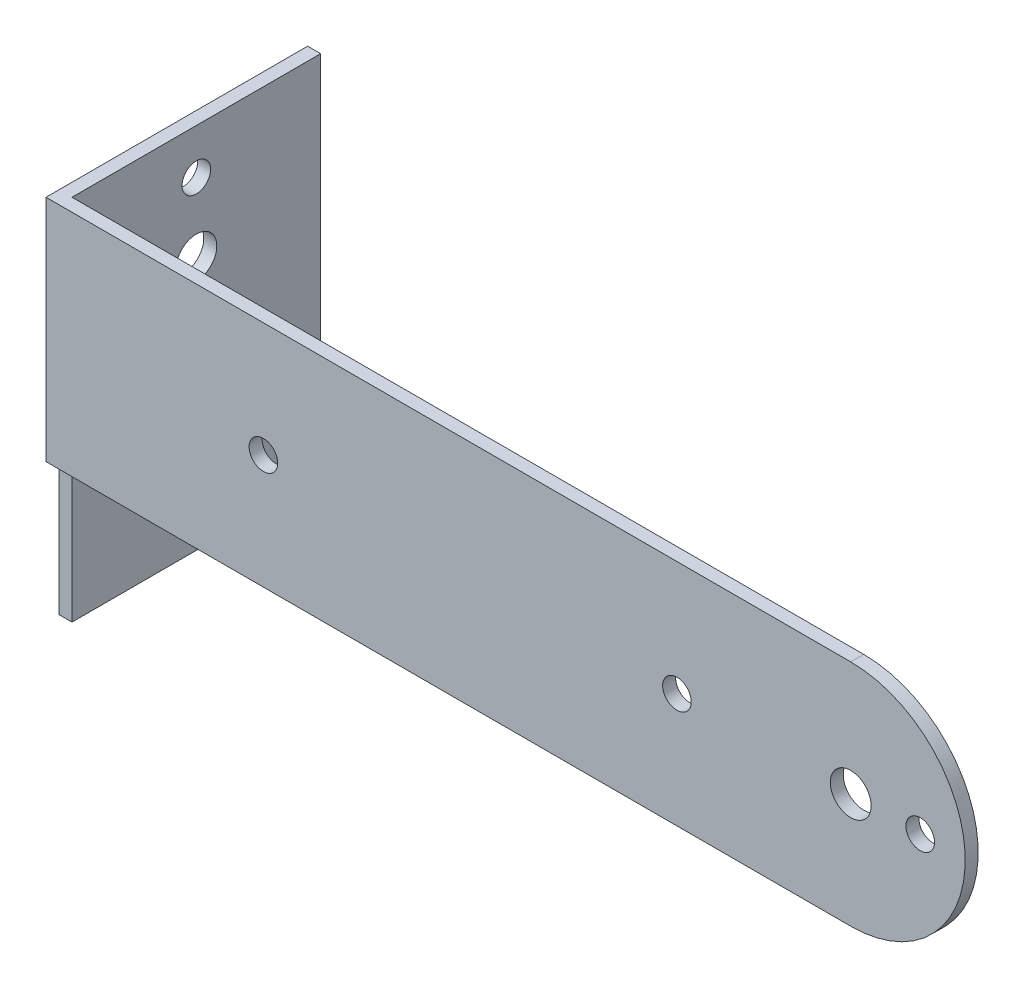
ISO-10303-21;
HEADER;
FILE_DESCRIPTION(('STEP AP214'),'2;1');
FILE_NAME('part.step','',(''),(''),'','','');
FILE_SCHEMA(('AUTOMOTIVE_DESIGN { 1 0 10303 214 1 1 1 1 }'));
ENDSEC;
DATA;
#1=APPLICATION_CONTEXT('core data for automotive mechanical design processes');
#2=APPLICATION_PROTOCOL_DEFINITION('international standard','automotive_design',2000,#1);
#3=PRODUCT_CONTEXT('',#1,'mechanical');
#4=PRODUCT('Part','Part','',(#3));
#5=PRODUCT_RELATED_PRODUCT_CATEGORY('part','',(#4));
#6=PRODUCT_DEFINITION_FORMATION('','',#4);
#7=PRODUCT_DEFINITION_CONTEXT('part definition',#1,'design');
#8=PRODUCT_DEFINITION('design','',#6,#7);
#9=PRODUCT_DEFINITION_SHAPE('','',#8);
#10=(LENGTH_UNIT() NAMED_UNIT(*) SI_UNIT(.MILLI.,.METRE.));
#11=(NAMED_UNIT(*) PLANE_ANGLE_UNIT() SI_UNIT($,.RADIAN.));
#12=(NAMED_UNIT(*) SI_UNIT($,.STERADIAN.) SOLID_ANGLE_UNIT());
#13=UNCERTAINTY_MEASURE_WITH_UNIT(LENGTH_MEASURE(1.E-05),#10,'distance_accuracy_value','');
#14=(GEOMETRIC_REPRESENTATION_CONTEXT(3) GLOBAL_UNCERTAINTY_ASSIGNED_CONTEXT((#13)) GLOBAL_UNIT_ASSIGNED_CONTEXT((#10,
#11,#12)) REPRESENTATION_CONTEXT('',''));
#15=CARTESIAN_POINT('',(0.,0.,0.));
#16=DIRECTION('',(0.,0.,1.));
#17=DIRECTION('',(1.,0.,0.));
#18=AXIS2_PLACEMENT_3D('',#15,#16,#17);
#19=CARTESIAN_POINT('',(0.,0.,0.));
#20=DIRECTION('',(0.,0.,1.));
#21=DIRECTION('',(1.,0.,0.));
#22=AXIS2_PLACEMENT_3D('',#19,#20,#21);
#23=PLANE('',#22);
#24=CARTESIAN_POINT('',(8.5,0.,0.));
#25=DIRECTION('',(0.,0.,-1.));
#26=DIRECTION('',(-1.,0.,0.));
#27=AXIS2_PLACEMENT_3D('',#24,#25,#26);
#28=CIRCLE('',#27,1.75);
#29=CARTESIAN_POINT('',(6.75,0.,0.));
#30=VERTEX_POINT('',#29);
#31=EDGE_CURVE('E187',#30,#30,#28,.T.);
#32=ORIENTED_EDGE('',*,*,#31,.F.);
#33=EDGE_LOOP('',(#32));
#34=FACE_BOUND('',#33,.T.);
#35=CARTESIAN_POINT('',(0.,0.,0.));
#36=DIRECTION('',(0.,0.,-1.));
#37=DIRECTION('',(-1.,0.,0.));
#38=AXIS2_PLACEMENT_3D('',#35,#36,#37);
#39=CIRCLE('',#38,2.5);
#40=CARTESIAN_POINT('',(-2.5,0.,0.));
#41=VERTEX_POINT('',#40);
#42=EDGE_CURVE('E193',#41,#41,#39,.T.);
#43=ORIENTED_EDGE('',*,*,#42,.F.);
#44=EDGE_LOOP('',(#43));
#45=FACE_BOUND('',#44,.T.);
#46=CARTESIAN_POINT('',(-21.25,0.,0.));
#47=DIRECTION('',(0.,0.,-1.));
#48=DIRECTION('',(-1.,0.,0.));
#49=AXIS2_PLACEMENT_3D('',#46,#47,#48);
#50=CIRCLE('',#49,1.75);
#51=CARTESIAN_POINT('',(-23.,0.,0.));
#52=VERTEX_POINT('',#51);
#53=EDGE_CURVE('E166',#52,#52,#50,.T.);
#54=ORIENTED_EDGE('',*,*,#53,.F.);
#55=EDGE_LOOP('',(#54));
#56=FACE_BOUND('',#55,.T.);
#57=CARTESIAN_POINT('',(-71.82,0.,0.));
#58=DIRECTION('',(0.,0.,-1.));
#59=DIRECTION('',(-1.,0.,0.));
#60=AXIS2_PLACEMENT_3D('',#57,#58,#59);
#61=CIRCLE('',#60,1.75);
#62=CARTESIAN_POINT('',(-73.57,0.,0.));
#63=VERTEX_POINT('',#62);
#64=EDGE_CURVE('E132',#63,#63,#61,.T.);
#65=ORIENTED_EDGE('',*,*,#64,.F.);
#66=EDGE_LOOP('',(#65));
#67=FACE_BOUND('',#66,.T.);
#68=DIRECTION('',(0.,-1.,0.));
#69=VECTOR('',#68,1.);
#70=CARTESIAN_POINT('',(-96.8200000000001,14.,0.));
#71=LINE('',#70,#69);
#72=CARTESIAN_POINT('',(-96.82,14.,0.));
#73=VERTEX_POINT('',#72);
#74=CARTESIAN_POINT('',(-96.8200000000001,-14.,0.));
#75=VERTEX_POINT('',#74);
#76=EDGE_CURVE('E51',#73,#75,#71,.T.);
#77=ORIENTED_EDGE('',*,*,#76,.F.);
#78=DIRECTION('',(-1.,0.,0.));
#79=VECTOR('',#78,1.);
#80=CARTESIAN_POINT('',(0.,14.,0.));
#81=LINE('',#80,#79);
#82=CARTESIAN_POINT('',(0.,14.,0.));
#83=VERTEX_POINT('',#82);
#84=EDGE_CURVE('E159',#83,#73,#81,.T.);
#85=ORIENTED_EDGE('',*,*,#84,.F.);
#86=CARTESIAN_POINT('',(0.,0.,0.));
#87=DIRECTION('',(0.,0.,1.));
#88=DIRECTION('',(1.,0.,0.));
#89=AXIS2_PLACEMENT_3D('',#86,#87,#88);
#90=CIRCLE('',#89,14.);
#91=CARTESIAN_POINT('',(0.,-14.,0.));
#92=VERTEX_POINT('',#91);
#93=EDGE_CURVE('E149',#92,#83,#90,.T.);
#94=ORIENTED_EDGE('',*,*,#93,.F.);
#95=DIRECTION('',(1.,0.,0.));
#96=VECTOR('',#95,1.);
#97=CARTESIAN_POINT('',(-98.41,-14.,0.));
#98=LINE('',#97,#96);
#99=EDGE_CURVE('E76',#75,#92,#98,.T.);
#100=ORIENTED_EDGE('',*,*,#99,.F.);
#101=EDGE_LOOP('',(#77,#85,#94,#100));
#102=FACE_BOUND('',#101,.T.);
#103=ADVANCED_FACE('F34',(#34,#45,#56,#67,#102),#23,.F.);
#104=CARTESIAN_POINT('',(0.,0.,1.59));
#105=DIRECTION('',(0.,0.,-1.));
#106=DIRECTION('',(-1.,0.,0.));
#107=AXIS2_PLACEMENT_3D('',#104,#105,#106);
#108=CYLINDRICAL_SURFACE('',#107,14.);
#109=ORIENTED_EDGE('',*,*,#93,.T.);
#110=DIRECTION('',(0.,0.,-1.));
#111=VECTOR('',#110,1.);
#112=CARTESIAN_POINT('',(0.,14.,1.59));
#113=LINE('',#112,#111);
#114=CARTESIAN_POINT('',(0.,14.,1.59));
#115=VERTEX_POINT('',#114);
#116=EDGE_CURVE('E11',#115,#83,#113,.T.);
#117=ORIENTED_EDGE('',*,*,#116,.F.);
#118=CARTESIAN_POINT('',(0.,0.,1.59));
#119=DIRECTION('',(0.,0.,1.));
#120=DIRECTION('',(1.,0.,0.));
#121=AXIS2_PLACEMENT_3D('',#118,#119,#120);
#122=CIRCLE('',#121,14.);
#123=CARTESIAN_POINT('',(0.,-14.,1.59));
#124=VERTEX_POINT('',#123);
#125=EDGE_CURVE('E150',#124,#115,#122,.T.);
#126=ORIENTED_EDGE('',*,*,#125,.F.);
#127=DIRECTION('',(0.,0.,-1.));
#128=VECTOR('',#127,1.);
#129=CARTESIAN_POINT('',(0.,-14.,1.59));
#130=LINE('',#129,#128);
#131=EDGE_CURVE('E156',#124,#92,#130,.T.);
#132=ORIENTED_EDGE('',*,*,#131,.T.);
#133=EDGE_LOOP('',(#109,#117,#126,#132));
#134=FACE_BOUND('',#133,.T.);
#135=ADVANCED_FACE('F36',(#134),#108,.T.);
#136=CARTESIAN_POINT('',(0.,14.,1.59));
#137=DIRECTION('',(0.,-1.,0.));
#138=DIRECTION('',(0.,0.,-1.));
#139=AXIS2_PLACEMENT_3D('',#136,#137,#138);
#140=PLANE('',#139);
#141=ORIENTED_EDGE('',*,*,#84,.T.);
#142=DIRECTION('',(0.,0.,1.));
#143=VECTOR('',#142,1.);
#144=CARTESIAN_POINT('',(-96.8200000000001,14.,-30.41));
#145=LINE('',#144,#143);
#146=CARTESIAN_POINT('',(-96.8200000000001,14.,-30.41));
#147=VERTEX_POINT('',#146);
#148=EDGE_CURVE('E119',#147,#73,#145,.T.);
#149=ORIENTED_EDGE('',*,*,#148,.F.);
#150=DIRECTION('',(1.,0.,0.));
#151=VECTOR('',#150,1.);
#152=CARTESIAN_POINT('',(-98.41,14.,-30.41));
#153=LINE('',#152,#151);
#154=CARTESIAN_POINT('',(-98.41,14.,-30.41));
#155=VERTEX_POINT('',#154);
#156=EDGE_CURVE('E116',#155,#147,#153,.T.);
#157=ORIENTED_EDGE('',*,*,#156,.F.);
#158=DIRECTION('',(0.,0.,-1.));
#159=VECTOR('',#158,1.);
#160=CARTESIAN_POINT('',(-98.41,14.,1.59));
#161=LINE('',#160,#159);
#162=CARTESIAN_POINT('',(-98.41,14.,1.59));
#163=VERTEX_POINT('',#162);
#164=EDGE_CURVE('E43',#163,#155,#161,.T.);
#165=ORIENTED_EDGE('',*,*,#164,.F.);
#166=DIRECTION('',(-1.,0.,0.));
#167=VECTOR('',#166,1.);
#168=CARTESIAN_POINT('',(0.,14.,1.59));
#169=LINE('',#168,#167);
#170=EDGE_CURVE('E83',#115,#163,#169,.T.);
#171=ORIENTED_EDGE('',*,*,#170,.F.);
#172=ORIENTED_EDGE('',*,*,#116,.T.);
#173=EDGE_LOOP('',(#141,#149,#157,#165,#171,#172));
#174=FACE_BOUND('',#173,.T.);
#175=ADVANCED_FACE('F117',(#174),#140,.F.);
#176=CARTESIAN_POINT('',(-98.41,14.,1.59));
#177=DIRECTION('',(1.,0.,0.));
#178=DIRECTION('',(0.,0.,-1.));
#179=AXIS2_PLACEMENT_3D('',#176,#177,#178);
#180=PLANE('',#179);
#181=CARTESIAN_POINT('',(-98.41,8.5,-15.205));
#182=DIRECTION('',(-1.,0.,0.));
#183=DIRECTION('',(0.,0.,1.));
#184=AXIS2_PLACEMENT_3D('',#181,#182,#183);
#185=CIRCLE('',#184,1.75);
#186=CARTESIAN_POINT('',(-98.41,8.5,-13.455));
#187=VERTEX_POINT('',#186);
#188=EDGE_CURVE('E170',#187,#187,#185,.T.);
#189=ORIENTED_EDGE('',*,*,#188,.F.);
#190=EDGE_LOOP('',(#189));
#191=FACE_BOUND('',#190,.T.);
#192=CARTESIAN_POINT('',(-98.41,-21.25,-15.205));
#193=DIRECTION('',(-1.,0.,0.));
#194=DIRECTION('',(0.,0.,1.));
#195=AXIS2_PLACEMENT_3D('',#192,#193,#194);
#196=CIRCLE('',#195,1.75);
#197=CARTESIAN_POINT('',(-98.41,-21.25,-13.455));
#198=VERTEX_POINT('',#197);
#199=EDGE_CURVE('E175',#198,#198,#196,.T.);
#200=ORIENTED_EDGE('',*,*,#199,.F.);
#201=EDGE_LOOP('',(#200));
#202=FACE_BOUND('',#201,.T.);
#203=CARTESIAN_POINT('',(-98.41,0.,-15.205));
#204=DIRECTION('',(-1.,0.,0.));
#205=DIRECTION('',(0.,0.,1.));
#206=AXIS2_PLACEMENT_3D('',#203,#204,#205);
#207=CIRCLE('',#206,2.5);
#208=CARTESIAN_POINT('',(-98.41,0.,-12.705));
#209=VERTEX_POINT('',#208);
#210=EDGE_CURVE('E167',#209,#209,#207,.T.);
#211=ORIENTED_EDGE('',*,*,#210,.F.);
#212=EDGE_LOOP('',(#211));
#213=FACE_BOUND('',#212,.T.);
#214=ORIENTED_EDGE('',*,*,#164,.T.);
#215=DIRECTION('',(0.,1.,0.));
#216=VECTOR('',#215,1.);
#217=CARTESIAN_POINT('',(-98.41,14.,-30.41));
#218=LINE('',#217,#216);
#219=CARTESIAN_POINT('',(-98.41,-31.,-30.41));
#220=VERTEX_POINT('',#219);
#221=EDGE_CURVE('E110',#220,#155,#218,.T.);
#222=ORIENTED_EDGE('',*,*,#221,.F.);
#223=DIRECTION('',(0.,0.,1.));
#224=VECTOR('',#223,1.);
#225=CARTESIAN_POINT('',(-98.41,-31.,-30.41));
#226=LINE('',#225,#224);
#227=CARTESIAN_POINT('',(-98.41,-31.,0.));
#228=VERTEX_POINT('',#227);
#229=EDGE_CURVE('E137',#220,#228,#226,.T.);
#230=ORIENTED_EDGE('',*,*,#229,.T.);
#231=DIRECTION('',(0.,1.,0.));
#232=VECTOR('',#231,1.);
#233=CARTESIAN_POINT('',(-98.41,14.,0.));
#234=LINE('',#233,#232);
#235=CARTESIAN_POINT('',(-98.41,-14.,0.));
#236=VERTEX_POINT('',#235);
#237=EDGE_CURVE('E138',#228,#236,#234,.T.);
#238=ORIENTED_EDGE('',*,*,#237,.T.);
#239=DIRECTION('',(0.,0.,-1.));
#240=VECTOR('',#239,1.);
#241=CARTESIAN_POINT('',(-98.41,-14.,1.59));
#242=LINE('',#241,#240);
#243=CARTESIAN_POINT('',(-98.41,-14.,1.59));
#244=VERTEX_POINT('',#243);
#245=EDGE_CURVE('E113',#244,#236,#242,.T.);
#246=ORIENTED_EDGE('',*,*,#245,.F.);
#247=DIRECTION('',(0.,-1.,0.));
#248=VECTOR('',#247,1.);
#249=CARTESIAN_POINT('',(-98.41,14.,1.59));
#250=LINE('',#249,#248);
#251=EDGE_CURVE('E112',#163,#244,#250,.T.);
#252=ORIENTED_EDGE('',*,*,#251,.F.);
#253=EDGE_LOOP('',(#214,#222,#230,#238,#246,#252));
#254=FACE_BOUND('',#253,.T.);
#255=ADVANCED_FACE('F107',(#191,#202,#213,#254),#180,.F.);
#256=CARTESIAN_POINT('',(-98.41,-14.,1.59));
#257=DIRECTION('',(0.,1.,0.));
#258=DIRECTION('',(0.,0.,1.));
#259=AXIS2_PLACEMENT_3D('',#256,#257,#258);
#260=PLANE('',#259);
#261=EDGE_CURVE('E152',#236,#75,#98,.T.);
#262=ORIENTED_EDGE('',*,*,#261,.T.);
#263=ORIENTED_EDGE('',*,*,#99,.T.);
#264=ORIENTED_EDGE('',*,*,#131,.F.);
#265=DIRECTION('',(1.,0.,0.));
#266=VECTOR('',#265,1.);
#267=CARTESIAN_POINT('',(-98.41,-14.,1.59));
#268=LINE('',#267,#266);
#269=EDGE_CURVE('E60',#244,#124,#268,.T.);
#270=ORIENTED_EDGE('',*,*,#269,.F.);
#271=ORIENTED_EDGE('',*,*,#245,.T.);
#272=EDGE_LOOP('',(#262,#263,#264,#270,#271));
#273=FACE_BOUND('',#272,.T.);
#274=ADVANCED_FACE('F221',(#273),#260,.F.);
#275=CARTESIAN_POINT('',(0.,0.,1.59));
#276=DIRECTION('',(0.,0.,1.));
#277=DIRECTION('',(1.,0.,0.));
#278=AXIS2_PLACEMENT_3D('',#275,#276,#277);
#279=PLANE('',#278);
#280=CARTESIAN_POINT('',(8.5,0.,1.59));
#281=DIRECTION('',(0.,0.,-1.));
#282=DIRECTION('',(-1.,0.,0.));
#283=AXIS2_PLACEMENT_3D('',#280,#281,#282);
#284=CIRCLE('',#283,1.75);
#285=CARTESIAN_POINT('',(6.75,0.,1.59));
#286=VERTEX_POINT('',#285);
#287=EDGE_CURVE('E184',#286,#286,#284,.T.);
#288=ORIENTED_EDGE('',*,*,#287,.T.);
#289=EDGE_LOOP('',(#288));
#290=FACE_BOUND('',#289,.T.);
#291=CARTESIAN_POINT('',(0.,0.,1.59));
#292=DIRECTION('',(0.,0.,-1.));
#293=DIRECTION('',(-1.,0.,0.));
#294=AXIS2_PLACEMENT_3D('',#291,#292,#293);
#295=CIRCLE('',#294,2.5);
#296=CARTESIAN_POINT('',(-2.5,0.,1.59));
#297=VERTEX_POINT('',#296);
#298=EDGE_CURVE('E190',#297,#297,#295,.T.);
#299=ORIENTED_EDGE('',*,*,#298,.T.);
#300=EDGE_LOOP('',(#299));
#301=FACE_BOUND('',#300,.T.);
#302=CARTESIAN_POINT('',(-21.25,0.,1.59));
#303=DIRECTION('',(0.,0.,-1.));
#304=DIRECTION('',(-1.,0.,0.));
#305=AXIS2_PLACEMENT_3D('',#302,#303,#304);
#306=CIRCLE('',#305,1.75);
#307=CARTESIAN_POINT('',(-23.,0.,1.59));
#308=VERTEX_POINT('',#307);
#309=EDGE_CURVE('E196',#308,#308,#306,.T.);
#310=ORIENTED_EDGE('',*,*,#309,.T.);
#311=EDGE_LOOP('',(#310));
#312=FACE_BOUND('',#311,.T.);
#313=CARTESIAN_POINT('',(-71.82,0.,1.59));
#314=DIRECTION('',(0.,0.,-1.));
#315=DIRECTION('',(-1.,0.,0.));
#316=AXIS2_PLACEMENT_3D('',#313,#314,#315);
#317=CIRCLE('',#316,1.75);
#318=CARTESIAN_POINT('',(-73.57,0.,1.59));
#319=VERTEX_POINT('',#318);
#320=EDGE_CURVE('E142',#319,#319,#317,.T.);
#321=ORIENTED_EDGE('',*,*,#320,.T.);
#322=EDGE_LOOP('',(#321));
#323=FACE_BOUND('',#322,.T.);
#324=ORIENTED_EDGE('',*,*,#125,.T.);
#325=ORIENTED_EDGE('',*,*,#170,.T.);
#326=ORIENTED_EDGE('',*,*,#251,.T.);
#327=ORIENTED_EDGE('',*,*,#269,.T.);
#328=EDGE_LOOP('',(#324,#325,#326,#327));
#329=FACE_BOUND('',#328,.T.);
#330=ADVANCED_FACE('F219',(#290,#301,#312,#323,#329),#279,.T.);
#331=CARTESIAN_POINT('',(0.,0.,0.));
#332=DIRECTION('',(0.,0.,1.));
#333=DIRECTION('',(1.,0.,0.));
#334=AXIS2_PLACEMENT_3D('',#331,#332,#333);
#335=PLANE('',#334);
#336=ORIENTED_EDGE('',*,*,#261,.F.);
#337=ORIENTED_EDGE('',*,*,#237,.F.);
#338=DIRECTION('',(-1.,0.,0.));
#339=VECTOR('',#338,1.);
#340=CARTESIAN_POINT('',(-98.41,-31.,0.));
#341=LINE('',#340,#339);
#342=CARTESIAN_POINT('',(-96.8200000000001,-31.,0.));
#343=VERTEX_POINT('',#342);
#344=EDGE_CURVE('E128',#343,#228,#341,.T.);
#345=ORIENTED_EDGE('',*,*,#344,.F.);
#346=EDGE_CURVE('E141',#75,#343,#71,.T.);
#347=ORIENTED_EDGE('',*,*,#346,.F.);
#348=EDGE_LOOP('',(#336,#337,#345,#347));
#349=FACE_BOUND('',#348,.T.);
#350=ADVANCED_FACE('F248',(#349),#335,.T.);
#351=CARTESIAN_POINT('',(-96.8200000000001,14.,-30.41));
#352=DIRECTION('',(-1.,0.,0.));
#353=DIRECTION('',(0.,-1.,0.));
#354=AXIS2_PLACEMENT_3D('',#351,#352,#353);
#355=PLANE('',#354);
#356=CARTESIAN_POINT('',(-96.8200000000001,8.5,-15.205));
#357=DIRECTION('',(-1.,0.,0.));
#358=DIRECTION('',(0.,-1.,0.));
#359=AXIS2_PLACEMENT_3D('',#356,#357,#358);
#360=CIRCLE('',#359,1.75);
#361=CARTESIAN_POINT('',(-96.8200000000001,6.75,-15.205));
#362=VERTEX_POINT('',#361);
#363=EDGE_CURVE('E38',#362,#362,#360,.T.);
#364=ORIENTED_EDGE('',*,*,#363,.T.);
#365=EDGE_LOOP('',(#364));
#366=FACE_BOUND('',#365,.T.);
#367=CARTESIAN_POINT('',(-96.8200000000001,-21.25,-15.205));
#368=DIRECTION('',(-1.,0.,0.));
#369=DIRECTION('',(0.,-1.,0.));
#370=AXIS2_PLACEMENT_3D('',#367,#368,#369);
#371=CIRCLE('',#370,1.75);
#372=CARTESIAN_POINT('',(-96.8200000000001,-23.,-15.205));
#373=VERTEX_POINT('',#372);
#374=EDGE_CURVE('E168',#373,#373,#371,.T.);
#375=ORIENTED_EDGE('',*,*,#374,.T.);
#376=EDGE_LOOP('',(#375));
#377=FACE_BOUND('',#376,.T.);
#378=CARTESIAN_POINT('',(-96.8200000000001,0.,-15.205));
#379=DIRECTION('',(-1.,0.,0.));
#380=DIRECTION('',(0.,-1.,0.));
#381=AXIS2_PLACEMENT_3D('',#378,#379,#380);
#382=CIRCLE('',#381,2.5);
#383=CARTESIAN_POINT('',(-96.8200000000001,-2.5,-15.205));
#384=VERTEX_POINT('',#383);
#385=EDGE_CURVE('E164',#384,#384,#382,.T.);
#386=ORIENTED_EDGE('',*,*,#385,.T.);
#387=EDGE_LOOP('',(#386));
#388=FACE_BOUND('',#387,.T.);
#389=ORIENTED_EDGE('',*,*,#76,.T.);
#390=ORIENTED_EDGE('',*,*,#346,.T.);
#391=DIRECTION('',(0.,0.,1.));
#392=VECTOR('',#391,1.);
#393=CARTESIAN_POINT('',(-96.8200000000001,-31.,-30.41));
#394=LINE('',#393,#392);
#395=CARTESIAN_POINT('',(-96.8200000000001,-31.,-30.41));
#396=VERTEX_POINT('',#395);
#397=EDGE_CURVE('E145',#396,#343,#394,.T.);
#398=ORIENTED_EDGE('',*,*,#397,.F.);
#399=DIRECTION('',(0.,-1.,0.));
#400=VECTOR('',#399,1.);
#401=CARTESIAN_POINT('',(-96.8200000000001,14.,-30.41));
#402=LINE('',#401,#400);
#403=EDGE_CURVE('E122',#147,#396,#402,.T.);
#404=ORIENTED_EDGE('',*,*,#403,.F.);
#405=ORIENTED_EDGE('',*,*,#148,.T.);
#406=EDGE_LOOP('',(#389,#390,#398,#404,#405));
#407=FACE_BOUND('',#406,.T.);
#408=ADVANCED_FACE('F255',(#366,#377,#388,#407),#355,.F.);
#409=CARTESIAN_POINT('',(-98.41,-31.,-30.41));
#410=DIRECTION('',(0.,1.,0.));
#411=DIRECTION('',(0.,0.,1.));
#412=AXIS2_PLACEMENT_3D('',#409,#410,#411);
#413=PLANE('',#412);
#414=ORIENTED_EDGE('',*,*,#344,.T.);
#415=ORIENTED_EDGE('',*,*,#229,.F.);
#416=DIRECTION('',(-1.,0.,0.));
#417=VECTOR('',#416,1.);
#418=CARTESIAN_POINT('',(-98.41,-31.,-30.41));
#419=LINE('',#418,#417);
#420=EDGE_CURVE('E126',#396,#220,#419,.T.);
#421=ORIENTED_EDGE('',*,*,#420,.F.);
#422=ORIENTED_EDGE('',*,*,#397,.T.);
#423=EDGE_LOOP('',(#414,#415,#421,#422));
#424=FACE_BOUND('',#423,.T.);
#425=ADVANCED_FACE('F263',(#424),#413,.F.);
#426=CARTESIAN_POINT('',(0.,0.,-30.41));
#427=DIRECTION('',(0.,0.,1.));
#428=DIRECTION('',(1.,0.,0.));
#429=AXIS2_PLACEMENT_3D('',#426,#427,#428);
#430=PLANE('',#429);
#431=ORIENTED_EDGE('',*,*,#221,.T.);
#432=ORIENTED_EDGE('',*,*,#156,.T.);
#433=ORIENTED_EDGE('',*,*,#403,.T.);
#434=ORIENTED_EDGE('',*,*,#420,.T.);
#435=EDGE_LOOP('',(#431,#432,#433,#434));
#436=FACE_BOUND('',#435,.T.);
#437=ADVANCED_FACE('F124',(#436),#430,.F.);
#438=CARTESIAN_POINT('',(-71.82,0.,1.59));
#439=DIRECTION('',(0.,0.,-1.));
#440=DIRECTION('',(-1.,0.,0.));
#441=AXIS2_PLACEMENT_3D('',#438,#439,#440);
#442=CYLINDRICAL_SURFACE('',#441,1.75);
#443=CARTESIAN_POINT('',(-73.57,0.,1.59));
#444=CARTESIAN_POINT('',(-73.57,0.,1.5734375));
#445=CARTESIAN_POINT('',(-73.57,0.,1.556875));
#446=CARTESIAN_POINT('',(-73.57,0.,1.52375));
#447=CARTESIAN_POINT('',(-73.57,0.,1.5071875));
#448=CARTESIAN_POINT('',(-73.57,0.,1.4740625));
#449=CARTESIAN_POINT('',(-73.57,0.,1.4575));
#450=CARTESIAN_POINT('',(-73.57,0.,1.424375));
#451=CARTESIAN_POINT('',(-73.57,0.,1.4078125));
#452=CARTESIAN_POINT('',(-73.57,0.,1.3746875));
#453=CARTESIAN_POINT('',(-73.57,0.,1.358125));
#454=CARTESIAN_POINT('',(-73.57,0.,1.325));
#455=CARTESIAN_POINT('',(-73.57,0.,1.3084375));
#456=CARTESIAN_POINT('',(-73.57,0.,1.2753125));
#457=CARTESIAN_POINT('',(-73.57,0.,1.25875));
#458=CARTESIAN_POINT('',(-73.57,0.,1.225625));
#459=CARTESIAN_POINT('',(-73.57,0.,1.2090625));
#460=CARTESIAN_POINT('',(-73.57,0.,1.1759375));
#461=CARTESIAN_POINT('',(-73.57,0.,1.159375));
#462=CARTESIAN_POINT('',(-73.57,0.,1.12625));
#463=CARTESIAN_POINT('',(-73.57,0.,1.1096875));
#464=CARTESIAN_POINT('',(-73.57,0.,1.0765625));
#465=CARTESIAN_POINT('',(-73.57,0.,1.06));
#466=CARTESIAN_POINT('',(-73.57,0.,1.026875));
#467=CARTESIAN_POINT('',(-73.57,0.,1.0103125));
#468=CARTESIAN_POINT('',(-73.57,0.,0.9771875));
#469=CARTESIAN_POINT('',(-73.57,0.,0.960625));
#470=CARTESIAN_POINT('',(-73.57,0.,0.9275));
#471=CARTESIAN_POINT('',(-73.57,0.,0.9109375));
#472=CARTESIAN_POINT('',(-73.57,0.,0.8778125));
#473=CARTESIAN_POINT('',(-73.57,0.,0.86125));
#474=CARTESIAN_POINT('',(-73.57,0.,0.828125));
#475=CARTESIAN_POINT('',(-73.57,0.,0.8115625));
#476=CARTESIAN_POINT('',(-73.57,0.,0.7784375));
#477=CARTESIAN_POINT('',(-73.57,0.,0.761875));
#478=CARTESIAN_POINT('',(-73.57,0.,0.72875));
#479=CARTESIAN_POINT('',(-73.57,0.,0.7121875));
#480=CARTESIAN_POINT('',(-73.57,0.,0.6790625));
#481=CARTESIAN_POINT('',(-73.57,0.,0.6625));
#482=CARTESIAN_POINT('',(-73.57,0.,0.629375));
#483=CARTESIAN_POINT('',(-73.57,0.,0.6128125));
#484=CARTESIAN_POINT('',(-73.57,0.,0.5796875));
#485=CARTESIAN_POINT('',(-73.57,0.,0.563125));
#486=CARTESIAN_POINT('',(-73.57,0.,0.53));
#487=CARTESIAN_POINT('',(-73.57,0.,0.5134375));
#488=CARTESIAN_POINT('',(-73.57,0.,0.4803125));
#489=CARTESIAN_POINT('',(-73.57,0.,0.46375));
#490=CARTESIAN_POINT('',(-73.57,0.,0.430625));
#491=CARTESIAN_POINT('',(-73.57,0.,0.4140625));
#492=CARTESIAN_POINT('',(-73.57,0.,0.3809375));
#493=CARTESIAN_POINT('',(-73.57,0.,0.364375));
#494=CARTESIAN_POINT('',(-73.57,0.,0.33125));
#495=CARTESIAN_POINT('',(-73.57,0.,0.3146875));
#496=CARTESIAN_POINT('',(-73.57,0.,0.2815625));
#497=CARTESIAN_POINT('',(-73.57,0.,0.265));
#498=CARTESIAN_POINT('',(-73.57,0.,0.231875));
#499=CARTESIAN_POINT('',(-73.57,0.,0.2153125));
#500=CARTESIAN_POINT('',(-73.57,0.,0.1821875));
#501=CARTESIAN_POINT('',(-73.57,0.,0.165625));
#502=CARTESIAN_POINT('',(-73.57,0.,0.1325));
#503=CARTESIAN_POINT('',(-73.57,0.,0.1159375));
#504=CARTESIAN_POINT('',(-73.57,0.,0.0828125000000001));
#505=CARTESIAN_POINT('',(-73.57,0.,0.06625));
#506=CARTESIAN_POINT('',(-73.57,0.,0.033125));
#507=CARTESIAN_POINT('',(-73.57,0.,0.0165625));
#508=CARTESIAN_POINT('',(-73.57,0.,0.));
#509=B_SPLINE_CURVE_WITH_KNOTS('',3,(#443,#444,#445,#446,#447,#448,#449,#450,#451,#452,#453,
#454,#455,#456,#457,#458,#459,#460,#461,#462,#463,#464,#465,#466,#467,#468,#469,#470,#471,#472,
#473,#474,#475,#476,#477,#478,#479,#480,#481,#482,#483,#484,#485,#486,#487,#488,#489,#490,#491,
#492,#493,#494,#495,#496,#497,#498,#499,#500,#501,#502,#503,#504,#505,#506,#507,#508),
.UNSPECIFIED.,.F.,.F.,(4,2,2,2,2,2,2,2,2,2,2,2,2,2,2,2,2,2,2,2,2,2,2,2,2,2,2,2,2,2,2,2,4),(0.,
0.0496875,0.0993750000000001,0.1490625,0.19875,0.2484375,0.298125,0.3478125,0.3975,0.4471875,
0.496875,0.5465625,0.59625,0.6459375,0.695625,0.7453125,0.795,0.8446875,0.894375,0.9440625,
0.99375,1.0434375,1.093125,1.1428125,1.1925,1.2421875,1.291875,1.3415625,1.39125,1.4409375,
1.490625,1.5403125,1.59),.UNSPECIFIED.);
#510=EDGE_CURVE('BSEAM206',#319,#63,#509,.T.);
#511=ORIENTED_EDGE('',*,*,#320,.F.);
#512=ORIENTED_EDGE('',*,*,#64,.T.);
#513=ORIENTED_EDGE('',*,*,#510,.T.);
#514=ORIENTED_EDGE('',*,*,#510,.F.);
#515=EDGE_LOOP('',(#511,#513,#512,#514));
#516=FACE_BOUND('',#515,.T.);
#517=ADVANCED_FACE('F206',(#516),#442,.F.);
#518=CARTESIAN_POINT('',(-21.25,0.,1.59));
#519=DIRECTION('',(0.,0.,-1.));
#520=DIRECTION('',(-1.,0.,0.));
#521=AXIS2_PLACEMENT_3D('',#518,#519,#520);
#522=CYLINDRICAL_SURFACE('',#521,1.75);
#523=CARTESIAN_POINT('',(-23.,0.,1.59));
#524=CARTESIAN_POINT('',(-23.,0.,1.5734375));
#525=CARTESIAN_POINT('',(-23.,0.,1.556875));
#526=CARTESIAN_POINT('',(-23.,0.,1.52375));
#527=CARTESIAN_POINT('',(-23.,0.,1.5071875));
#528=CARTESIAN_POINT('',(-23.,0.,1.4740625));
#529=CARTESIAN_POINT('',(-23.,0.,1.4575));
#530=CARTESIAN_POINT('',(-23.,0.,1.424375));
#531=CARTESIAN_POINT('',(-23.,0.,1.4078125));
#532=CARTESIAN_POINT('',(-23.,0.,1.3746875));
#533=CARTESIAN_POINT('',(-23.,0.,1.358125));
#534=CARTESIAN_POINT('',(-23.,0.,1.325));
#535=CARTESIAN_POINT('',(-23.,0.,1.3084375));
#536=CARTESIAN_POINT('',(-23.,0.,1.2753125));
#537=CARTESIAN_POINT('',(-23.,0.,1.25875));
#538=CARTESIAN_POINT('',(-23.,0.,1.225625));
#539=CARTESIAN_POINT('',(-23.,0.,1.2090625));
#540=CARTESIAN_POINT('',(-23.,0.,1.1759375));
#541=CARTESIAN_POINT('',(-23.,0.,1.159375));
#542=CARTESIAN_POINT('',(-23.,0.,1.12625));
#543=CARTESIAN_POINT('',(-23.,0.,1.1096875));
#544=CARTESIAN_POINT('',(-23.,0.,1.0765625));
#545=CARTESIAN_POINT('',(-23.,0.,1.06));
#546=CARTESIAN_POINT('',(-23.,0.,1.026875));
#547=CARTESIAN_POINT('',(-23.,0.,1.0103125));
#548=CARTESIAN_POINT('',(-23.,0.,0.9771875));
#549=CARTESIAN_POINT('',(-23.,0.,0.960625));
#550=CARTESIAN_POINT('',(-23.,0.,0.9275));
#551=CARTESIAN_POINT('',(-23.,0.,0.9109375));
#552=CARTESIAN_POINT('',(-23.,0.,0.8778125));
#553=CARTESIAN_POINT('',(-23.,0.,0.86125));
#554=CARTESIAN_POINT('',(-23.,0.,0.828125));
#555=CARTESIAN_POINT('',(-23.,0.,0.8115625));
#556=CARTESIAN_POINT('',(-23.,0.,0.7784375));
#557=CARTESIAN_POINT('',(-23.,0.,0.761875));
#558=CARTESIAN_POINT('',(-23.,0.,0.72875));
#559=CARTESIAN_POINT('',(-23.,0.,0.7121875));
#560=CARTESIAN_POINT('',(-23.,0.,0.6790625));
#561=CARTESIAN_POINT('',(-23.,0.,0.6625));
#562=CARTESIAN_POINT('',(-23.,0.,0.629375));
#563=CARTESIAN_POINT('',(-23.,0.,0.6128125));
#564=CARTESIAN_POINT('',(-23.,0.,0.5796875));
#565=CARTESIAN_POINT('',(-23.,0.,0.563125));
#566=CARTESIAN_POINT('',(-23.,0.,0.53));
#567=CARTESIAN_POINT('',(-23.,0.,0.5134375));
#568=CARTESIAN_POINT('',(-23.,0.,0.4803125));
#569=CARTESIAN_POINT('',(-23.,0.,0.46375));
#570=CARTESIAN_POINT('',(-23.,0.,0.430625));
#571=CARTESIAN_POINT('',(-23.,0.,0.4140625));
#572=CARTESIAN_POINT('',(-23.,0.,0.3809375));
#573=CARTESIAN_POINT('',(-23.,0.,0.364375));
#574=CARTESIAN_POINT('',(-23.,0.,0.33125));
#575=CARTESIAN_POINT('',(-23.,0.,0.3146875));
#576=CARTESIAN_POINT('',(-23.,0.,0.2815625));
#577=CARTESIAN_POINT('',(-23.,0.,0.265));
#578=CARTESIAN_POINT('',(-23.,0.,0.231875));
#579=CARTESIAN_POINT('',(-23.,0.,0.2153125));
#580=CARTESIAN_POINT('',(-23.,0.,0.1821875));
#581=CARTESIAN_POINT('',(-23.,0.,0.165625));
#582=CARTESIAN_POINT('',(-23.,0.,0.1325));
#583=CARTESIAN_POINT('',(-23.,0.,0.1159375));
#584=CARTESIAN_POINT('',(-23.,0.,0.0828125000000001));
#585=CARTESIAN_POINT('',(-23.,0.,0.06625));
#586=CARTESIAN_POINT('',(-23.,0.,0.033125));
#587=CARTESIAN_POINT('',(-23.,0.,0.0165625));
#588=CARTESIAN_POINT('',(-23.,0.,0.));
#589=B_SPLINE_CURVE_WITH_KNOTS('',3,(#523,#524,#525,#526,#527,#528,#529,#530,#531,#532,#533,
#534,#535,#536,#537,#538,#539,#540,#541,#542,#543,#544,#545,#546,#547,#548,#549,#550,#551,#552,
#553,#554,#555,#556,#557,#558,#559,#560,#561,#562,#563,#564,#565,#566,#567,#568,#569,#570,#571,
#572,#573,#574,#575,#576,#577,#578,#579,#580,#581,#582,#583,#584,#585,#586,#587,#588),
.UNSPECIFIED.,.F.,.F.,(4,2,2,2,2,2,2,2,2,2,2,2,2,2,2,2,2,2,2,2,2,2,2,2,2,2,2,2,2,2,2,2,4),(0.,
0.0496875,0.0993750000000001,0.1490625,0.19875,0.2484375,0.298125,0.3478125,0.3975,0.4471875,
0.496875,0.5465625,0.59625,0.6459375,0.695625,0.7453125,0.795,0.8446875,0.894375,0.9440625,
0.99375,1.0434375,1.093125,1.1428125,1.1925,1.2421875,1.291875,1.3415625,1.39125,1.4409375,
1.490625,1.5403125,1.59),.UNSPECIFIED.);
#590=EDGE_CURVE('BSEAM282',#308,#52,#589,.T.);
#591=ORIENTED_EDGE('',*,*,#309,.F.);
#592=ORIENTED_EDGE('',*,*,#53,.T.);
#593=ORIENTED_EDGE('',*,*,#590,.T.);
#594=ORIENTED_EDGE('',*,*,#590,.F.);
#595=EDGE_LOOP('',(#591,#593,#592,#594));
#596=FACE_BOUND('',#595,.T.);
#597=ADVANCED_FACE('F282',(#596),#522,.F.);
#598=CARTESIAN_POINT('',(0.,0.,1.59));
#599=DIRECTION('',(0.,0.,-1.));
#600=DIRECTION('',(-1.,0.,0.));
#601=AXIS2_PLACEMENT_3D('',#598,#599,#600);
#602=CYLINDRICAL_SURFACE('',#601,2.5);
#603=CARTESIAN_POINT('',(-2.5,0.,1.59));
#604=CARTESIAN_POINT('',(-2.5,0.,1.5734375));
#605=CARTESIAN_POINT('',(-2.5,0.,1.556875));
#606=CARTESIAN_POINT('',(-2.5,0.,1.52375));
#607=CARTESIAN_POINT('',(-2.5,0.,1.5071875));
#608=CARTESIAN_POINT('',(-2.5,0.,1.4740625));
#609=CARTESIAN_POINT('',(-2.5,0.,1.4575));
#610=CARTESIAN_POINT('',(-2.5,0.,1.424375));
#611=CARTESIAN_POINT('',(-2.5,0.,1.4078125));
#612=CARTESIAN_POINT('',(-2.5,0.,1.3746875));
#613=CARTESIAN_POINT('',(-2.5,0.,1.358125));
#614=CARTESIAN_POINT('',(-2.5,0.,1.325));
#615=CARTESIAN_POINT('',(-2.5,0.,1.3084375));
#616=CARTESIAN_POINT('',(-2.5,0.,1.2753125));
#617=CARTESIAN_POINT('',(-2.5,0.,1.25875));
#618=CARTESIAN_POINT('',(-2.5,0.,1.225625));
#619=CARTESIAN_POINT('',(-2.5,0.,1.2090625));
#620=CARTESIAN_POINT('',(-2.5,0.,1.1759375));
#621=CARTESIAN_POINT('',(-2.5,0.,1.159375));
#622=CARTESIAN_POINT('',(-2.5,0.,1.12625));
#623=CARTESIAN_POINT('',(-2.5,0.,1.1096875));
#624=CARTESIAN_POINT('',(-2.5,0.,1.0765625));
#625=CARTESIAN_POINT('',(-2.5,0.,1.06));
#626=CARTESIAN_POINT('',(-2.5,0.,1.026875));
#627=CARTESIAN_POINT('',(-2.5,0.,1.0103125));
#628=CARTESIAN_POINT('',(-2.5,0.,0.9771875));
#629=CARTESIAN_POINT('',(-2.5,0.,0.960625));
#630=CARTESIAN_POINT('',(-2.5,0.,0.9275));
#631=CARTESIAN_POINT('',(-2.5,0.,0.9109375));
#632=CARTESIAN_POINT('',(-2.5,0.,0.8778125));
#633=CARTESIAN_POINT('',(-2.5,0.,0.86125));
#634=CARTESIAN_POINT('',(-2.5,0.,0.828125));
#635=CARTESIAN_POINT('',(-2.5,0.,0.8115625));
#636=CARTESIAN_POINT('',(-2.5,0.,0.7784375));
#637=CARTESIAN_POINT('',(-2.5,0.,0.761875));
#638=CARTESIAN_POINT('',(-2.5,0.,0.72875));
#639=CARTESIAN_POINT('',(-2.5,0.,0.7121875));
#640=CARTESIAN_POINT('',(-2.5,0.,0.6790625));
#641=CARTESIAN_POINT('',(-2.5,0.,0.6625));
#642=CARTESIAN_POINT('',(-2.5,0.,0.629375));
#643=CARTESIAN_POINT('',(-2.5,0.,0.6128125));
#644=CARTESIAN_POINT('',(-2.5,0.,0.5796875));
#645=CARTESIAN_POINT('',(-2.5,0.,0.563125));
#646=CARTESIAN_POINT('',(-2.5,0.,0.53));
#647=CARTESIAN_POINT('',(-2.5,0.,0.5134375));
#648=CARTESIAN_POINT('',(-2.5,0.,0.4803125));
#649=CARTESIAN_POINT('',(-2.5,0.,0.46375));
#650=CARTESIAN_POINT('',(-2.5,0.,0.430625));
#651=CARTESIAN_POINT('',(-2.5,0.,0.4140625));
#652=CARTESIAN_POINT('',(-2.5,0.,0.3809375));
#653=CARTESIAN_POINT('',(-2.5,0.,0.364375));
#654=CARTESIAN_POINT('',(-2.5,0.,0.33125));
#655=CARTESIAN_POINT('',(-2.5,0.,0.3146875));
#656=CARTESIAN_POINT('',(-2.5,0.,0.2815625));
#657=CARTESIAN_POINT('',(-2.5,0.,0.265));
#658=CARTESIAN_POINT('',(-2.5,0.,0.231875));
#659=CARTESIAN_POINT('',(-2.5,0.,0.2153125));
#660=CARTESIAN_POINT('',(-2.5,0.,0.1821875));
#661=CARTESIAN_POINT('',(-2.5,0.,0.165625));
#662=CARTESIAN_POINT('',(-2.5,0.,0.1325));
#663=CARTESIAN_POINT('',(-2.5,0.,0.1159375));
#664=CARTESIAN_POINT('',(-2.5,0.,0.0828125000000001));
#665=CARTESIAN_POINT('',(-2.5,0.,0.06625));
#666=CARTESIAN_POINT('',(-2.5,0.,0.033125));
#667=CARTESIAN_POINT('',(-2.5,0.,0.0165625));
#668=CARTESIAN_POINT('',(-2.5,0.,0.));
#669=B_SPLINE_CURVE_WITH_KNOTS('',3,(#603,#604,#605,#606,#607,#608,#609,#610,#611,#612,#613,
#614,#615,#616,#617,#618,#619,#620,#621,#622,#623,#624,#625,#626,#627,#628,#629,#630,#631,#632,
#633,#634,#635,#636,#637,#638,#639,#640,#641,#642,#643,#644,#645,#646,#647,#648,#649,#650,#651,
#652,#653,#654,#655,#656,#657,#658,#659,#660,#661,#662,#663,#664,#665,#666,#667,#668),
.UNSPECIFIED.,.F.,.F.,(4,2,2,2,2,2,2,2,2,2,2,2,2,2,2,2,2,2,2,2,2,2,2,2,2,2,2,2,2,2,2,2,4),(0.,
0.0496875,0.0993750000000001,0.1490625,0.19875,0.2484375,0.298125,0.3478125,0.3975,0.4471875,
0.496875,0.5465625,0.59625,0.6459375,0.695625,0.7453125,0.795,0.8446875,0.894375,0.9440625,
0.99375,1.0434375,1.093125,1.1428125,1.1925,1.2421875,1.291875,1.3415625,1.39125,1.4409375,
1.490625,1.5403125,1.59),.UNSPECIFIED.);
#670=EDGE_CURVE('BSEAM290',#297,#41,#669,.T.);
#671=ORIENTED_EDGE('',*,*,#298,.F.);
#672=ORIENTED_EDGE('',*,*,#42,.T.);
#673=ORIENTED_EDGE('',*,*,#670,.T.);
#674=ORIENTED_EDGE('',*,*,#670,.F.);
#675=EDGE_LOOP('',(#671,#673,#672,#674));
#676=FACE_BOUND('',#675,.T.);
#677=ADVANCED_FACE('F290',(#676),#602,.F.);
#678=CARTESIAN_POINT('',(8.5,0.,1.59));
#679=DIRECTION('',(0.,0.,-1.));
#680=DIRECTION('',(-1.,0.,0.));
#681=AXIS2_PLACEMENT_3D('',#678,#679,#680);
#682=CYLINDRICAL_SURFACE('',#681,1.75);
#683=CARTESIAN_POINT('',(6.75,0.,1.59));
#684=CARTESIAN_POINT('',(6.75,0.,1.5734375));
#685=CARTESIAN_POINT('',(6.75,0.,1.556875));
#686=CARTESIAN_POINT('',(6.75,0.,1.52375));
#687=CARTESIAN_POINT('',(6.75,0.,1.5071875));
#688=CARTESIAN_POINT('',(6.75,0.,1.4740625));
#689=CARTESIAN_POINT('',(6.75,0.,1.4575));
#690=CARTESIAN_POINT('',(6.75,0.,1.424375));
#691=CARTESIAN_POINT('',(6.75,0.,1.4078125));
#692=CARTESIAN_POINT('',(6.75,0.,1.3746875));
#693=CARTESIAN_POINT('',(6.75,0.,1.358125));
#694=CARTESIAN_POINT('',(6.75,0.,1.325));
#695=CARTESIAN_POINT('',(6.75,0.,1.3084375));
#696=CARTESIAN_POINT('',(6.75,0.,1.2753125));
#697=CARTESIAN_POINT('',(6.75,0.,1.25875));
#698=CARTESIAN_POINT('',(6.75,0.,1.225625));
#699=CARTESIAN_POINT('',(6.75,0.,1.2090625));
#700=CARTESIAN_POINT('',(6.75,0.,1.1759375));
#701=CARTESIAN_POINT('',(6.75,0.,1.159375));
#702=CARTESIAN_POINT('',(6.75,0.,1.12625));
#703=CARTESIAN_POINT('',(6.75,0.,1.1096875));
#704=CARTESIAN_POINT('',(6.75,0.,1.0765625));
#705=CARTESIAN_POINT('',(6.75,0.,1.06));
#706=CARTESIAN_POINT('',(6.75,0.,1.026875));
#707=CARTESIAN_POINT('',(6.75,0.,1.0103125));
#708=CARTESIAN_POINT('',(6.75,0.,0.9771875));
#709=CARTESIAN_POINT('',(6.75,0.,0.960625));
#710=CARTESIAN_POINT('',(6.75,0.,0.9275));
#711=CARTESIAN_POINT('',(6.75,0.,0.9109375));
#712=CARTESIAN_POINT('',(6.75,0.,0.8778125));
#713=CARTESIAN_POINT('',(6.75,0.,0.86125));
#714=CARTESIAN_POINT('',(6.75,0.,0.828125));
#715=CARTESIAN_POINT('',(6.75,0.,0.8115625));
#716=CARTESIAN_POINT('',(6.75,0.,0.7784375));
#717=CARTESIAN_POINT('',(6.75,0.,0.761875));
#718=CARTESIAN_POINT('',(6.75,0.,0.72875));
#719=CARTESIAN_POINT('',(6.75,0.,0.7121875));
#720=CARTESIAN_POINT('',(6.75,0.,0.6790625));
#721=CARTESIAN_POINT('',(6.75,0.,0.6625));
#722=CARTESIAN_POINT('',(6.75,0.,0.629375));
#723=CARTESIAN_POINT('',(6.75,0.,0.6128125));
#724=CARTESIAN_POINT('',(6.75,0.,0.5796875));
#725=CARTESIAN_POINT('',(6.75,0.,0.563125));
#726=CARTESIAN_POINT('',(6.75,0.,0.53));
#727=CARTESIAN_POINT('',(6.75,0.,0.5134375));
#728=CARTESIAN_POINT('',(6.75,0.,0.4803125));
#729=CARTESIAN_POINT('',(6.75,0.,0.46375));
#730=CARTESIAN_POINT('',(6.75,0.,0.430625));
#731=CARTESIAN_POINT('',(6.75,0.,0.4140625));
#732=CARTESIAN_POINT('',(6.75,0.,0.3809375));
#733=CARTESIAN_POINT('',(6.75,0.,0.364375));
#734=CARTESIAN_POINT('',(6.75,0.,0.33125));
#735=CARTESIAN_POINT('',(6.75,0.,0.3146875));
#736=CARTESIAN_POINT('',(6.75,0.,0.2815625));
#737=CARTESIAN_POINT('',(6.75,0.,0.265));
#738=CARTESIAN_POINT('',(6.75,0.,0.231875));
#739=CARTESIAN_POINT('',(6.75,0.,0.2153125));
#740=CARTESIAN_POINT('',(6.75,0.,0.1821875));
#741=CARTESIAN_POINT('',(6.75,0.,0.165625));
#742=CARTESIAN_POINT('',(6.75,0.,0.1325));
#743=CARTESIAN_POINT('',(6.75,0.,0.1159375));
#744=CARTESIAN_POINT('',(6.75,0.,0.0828125000000001));
#745=CARTESIAN_POINT('',(6.75,0.,0.06625));
#746=CARTESIAN_POINT('',(6.75,0.,0.033125));
#747=CARTESIAN_POINT('',(6.75,0.,0.0165625));
#748=CARTESIAN_POINT('',(6.75,0.,0.));
#749=B_SPLINE_CURVE_WITH_KNOTS('',3,(#683,#684,#685,#686,#687,#688,#689,#690,#691,#692,#693,
#694,#695,#696,#697,#698,#699,#700,#701,#702,#703,#704,#705,#706,#707,#708,#709,#710,#711,#712,
#713,#714,#715,#716,#717,#718,#719,#720,#721,#722,#723,#724,#725,#726,#727,#728,#729,#730,#731,
#732,#733,#734,#735,#736,#737,#738,#739,#740,#741,#742,#743,#744,#745,#746,#747,#748),
.UNSPECIFIED.,.F.,.F.,(4,2,2,2,2,2,2,2,2,2,2,2,2,2,2,2,2,2,2,2,2,2,2,2,2,2,2,2,2,2,2,2,4),(0.,
0.0496875,0.0993750000000001,0.1490625,0.19875,0.2484375,0.298125,0.3478125,0.3975,0.4471875,
0.496875,0.5465625,0.59625,0.6459375,0.695625,0.7453125,0.795,0.8446875,0.894375,0.9440625,
0.99375,1.0434375,1.093125,1.1428125,1.1925,1.2421875,1.291875,1.3415625,1.39125,1.4409375,
1.490625,1.5403125,1.59),.UNSPECIFIED.);
#750=EDGE_CURVE('BSEAM298',#286,#30,#749,.T.);
#751=ORIENTED_EDGE('',*,*,#287,.F.);
#752=ORIENTED_EDGE('',*,*,#31,.T.);
#753=ORIENTED_EDGE('',*,*,#750,.T.);
#754=ORIENTED_EDGE('',*,*,#750,.F.);
#755=EDGE_LOOP('',(#751,#753,#752,#754));
#756=FACE_BOUND('',#755,.T.);
#757=ADVANCED_FACE('F298',(#756),#682,.F.);
#758=CARTESIAN_POINT('',(-68.,0.,-15.205));
#759=DIRECTION('',(-1.,0.,0.));
#760=DIRECTION('',(0.,0.,1.));
#761=AXIS2_PLACEMENT_3D('',#758,#759,#760);
#762=CYLINDRICAL_SURFACE('',#761,2.5);
#763=ORIENTED_EDGE('',*,*,#210,.T.);
#764=EDGE_LOOP('',(#763));
#765=FACE_BOUND('',#764,.T.);
#766=ORIENTED_EDGE('',*,*,#385,.F.);
#767=EDGE_LOOP('',(#766));
#768=FACE_BOUND('',#767,.T.);
#769=ADVANCED_FACE('F305',(#765,#768),#762,.F.);
#770=CARTESIAN_POINT('',(-68.,-21.25,-15.205));
#771=DIRECTION('',(-1.,0.,0.));
#772=DIRECTION('',(0.,0.,1.));
#773=AXIS2_PLACEMENT_3D('',#770,#771,#772);
#774=CYLINDRICAL_SURFACE('',#773,1.75);
#775=ORIENTED_EDGE('',*,*,#199,.T.);
#776=EDGE_LOOP('',(#775));
#777=FACE_BOUND('',#776,.T.);
#778=ORIENTED_EDGE('',*,*,#374,.F.);
#779=EDGE_LOOP('',(#778));
#780=FACE_BOUND('',#779,.T.);
#781=ADVANCED_FACE('F312',(#777,#780),#774,.F.);
#782=CARTESIAN_POINT('',(-68.,8.5,-15.205));
#783=DIRECTION('',(-1.,0.,0.));
#784=DIRECTION('',(0.,0.,1.));
#785=AXIS2_PLACEMENT_3D('',#782,#783,#784);
#786=CYLINDRICAL_SURFACE('',#785,1.75);
#787=ORIENTED_EDGE('',*,*,#188,.T.);
#788=EDGE_LOOP('',(#787));
#789=FACE_BOUND('',#788,.T.);
#790=ORIENTED_EDGE('',*,*,#363,.F.);
#791=EDGE_LOOP('',(#790));
#792=FACE_BOUND('',#791,.T.);
#793=ADVANCED_FACE('F320',(#789,#792),#786,.F.);
#794=CLOSED_SHELL('',(#103,#135,#175,#255,#274,#330,#350,#408,#425,#437,#517,#597,#677,#757,
#769,#781,#793));
#795=MANIFOLD_SOLID_BREP('B2',#794);
#796=ADVANCED_BREP_SHAPE_REPRESENTATION('',(#18,#795),#14);
#797=SHAPE_DEFINITION_REPRESENTATION(#9,#796);
ENDSEC;
END-ISO-10303-21;
